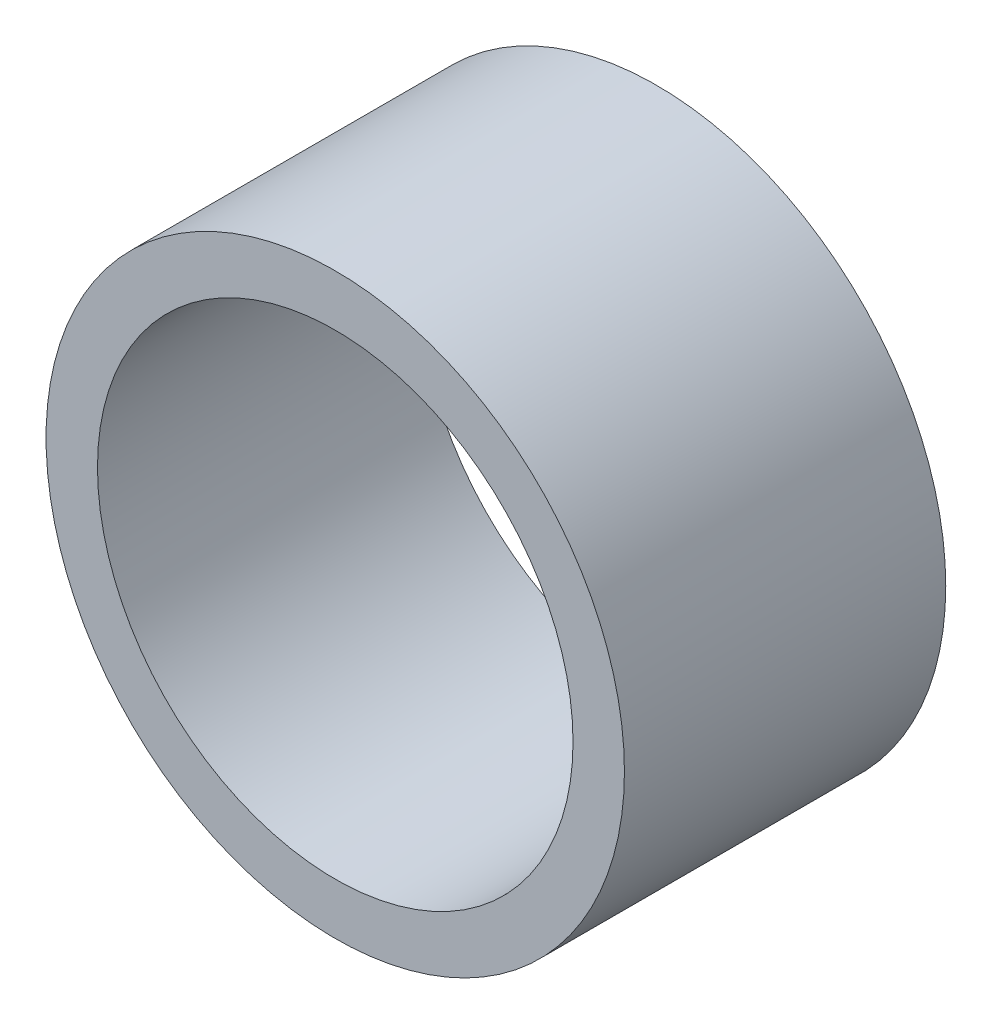
ISO-10303-21;
HEADER;
FILE_DESCRIPTION(('STEP AP214'),'2;1');
FILE_NAME('part.step','',(''),(''),'','','');
FILE_SCHEMA(('AUTOMOTIVE_DESIGN { 1 0 10303 214 1 1 1 1 }'));
ENDSEC;
DATA;
#1=APPLICATION_CONTEXT('core data for automotive mechanical design processes');
#2=APPLICATION_PROTOCOL_DEFINITION('international standard','automotive_design',2000,#1);
#3=PRODUCT_CONTEXT('',#1,'mechanical');
#4=PRODUCT('Part','Part','',(#3));
#5=PRODUCT_RELATED_PRODUCT_CATEGORY('part','',(#4));
#6=PRODUCT_DEFINITION_FORMATION('','',#4);
#7=PRODUCT_DEFINITION_CONTEXT('part definition',#1,'design');
#8=PRODUCT_DEFINITION('design','',#6,#7);
#9=PRODUCT_DEFINITION_SHAPE('','',#8);
#10=(LENGTH_UNIT() NAMED_UNIT(*) SI_UNIT(.MILLI.,.METRE.));
#11=(NAMED_UNIT(*) PLANE_ANGLE_UNIT() SI_UNIT($,.RADIAN.));
#12=(NAMED_UNIT(*) SI_UNIT($,.STERADIAN.) SOLID_ANGLE_UNIT());
#13=UNCERTAINTY_MEASURE_WITH_UNIT(LENGTH_MEASURE(1.E-05),#10,'distance_accuracy_value','');
#14=(GEOMETRIC_REPRESENTATION_CONTEXT(3) GLOBAL_UNCERTAINTY_ASSIGNED_CONTEXT((#13)) GLOBAL_UNIT_ASSIGNED_CONTEXT((#10,
#11,#12)) REPRESENTATION_CONTEXT('',''));
#15=CARTESIAN_POINT('',(0.,0.,0.));
#16=DIRECTION('',(0.,0.,1.));
#17=DIRECTION('',(1.,0.,0.));
#18=AXIS2_PLACEMENT_3D('',#15,#16,#17);
#19=CARTESIAN_POINT('',(0.,0.,5.));
#20=DIRECTION('',(0.,0.,1.));
#21=DIRECTION('',(1.,0.,0.));
#22=AXIS2_PLACEMENT_3D('',#19,#20,#21);
#23=PLANE('',#22);
#24=CARTESIAN_POINT('',(0.,0.,5.));
#25=DIRECTION('',(0.,0.,1.));
#26=DIRECTION('',(1.,0.,0.));
#27=AXIS2_PLACEMENT_3D('',#24,#25,#26);
#28=CIRCLE('',#27,4.5);
#29=CARTESIAN_POINT('',(4.5,0.,5.));
#30=VERTEX_POINT('',#29);
#31=EDGE_CURVE('E10',#30,#30,#28,.T.);
#32=ORIENTED_EDGE('',*,*,#31,.T.);
#33=EDGE_LOOP('',(#32));
#34=FACE_BOUND('',#33,.T.);
#35=CARTESIAN_POINT('',(0.,0.,5.));
#36=DIRECTION('',(0.,0.,1.));
#37=DIRECTION('',(1.,0.,0.));
#38=AXIS2_PLACEMENT_3D('',#35,#36,#37);
#39=CIRCLE('',#38,3.7);
#40=CARTESIAN_POINT('',(3.7,0.,5.));
#41=VERTEX_POINT('',#40);
#42=EDGE_CURVE('E48',#41,#41,#39,.T.);
#43=ORIENTED_EDGE('',*,*,#42,.F.);
#44=EDGE_LOOP('',(#43));
#45=FACE_BOUND('',#44,.T.);
#46=ADVANCED_FACE('F37',(#34,#45),#23,.T.);
#47=CARTESIAN_POINT('',(0.,0.,0.));
#48=DIRECTION('',(0.,0.,1.));
#49=DIRECTION('',(1.,0.,0.));
#50=AXIS2_PLACEMENT_3D('',#47,#48,#49);
#51=PLANE('',#50);
#52=CARTESIAN_POINT('',(0.,0.,0.));
#53=DIRECTION('',(0.,0.,1.));
#54=DIRECTION('',(1.,0.,0.));
#55=AXIS2_PLACEMENT_3D('',#52,#53,#54);
#56=CIRCLE('',#55,4.5);
#57=CARTESIAN_POINT('',(4.5,0.,0.));
#58=VERTEX_POINT('',#57);
#59=EDGE_CURVE('E41',#58,#58,#56,.T.);
#60=ORIENTED_EDGE('',*,*,#59,.F.);
#61=EDGE_LOOP('',(#60));
#62=FACE_BOUND('',#61,.T.);
#63=CARTESIAN_POINT('',(0.,0.,0.));
#64=DIRECTION('',(0.,0.,1.));
#65=DIRECTION('',(1.,0.,0.));
#66=AXIS2_PLACEMENT_3D('',#63,#64,#65);
#67=CIRCLE('',#66,3.7);
#68=CARTESIAN_POINT('',(3.7,0.,0.));
#69=VERTEX_POINT('',#68);
#70=EDGE_CURVE('E50',#69,#69,#67,.T.);
#71=ORIENTED_EDGE('',*,*,#70,.T.);
#72=EDGE_LOOP('',(#71));
#73=FACE_BOUND('',#72,.T.);
#74=ADVANCED_FACE('F60',(#62,#73),#51,.F.);
#75=CARTESIAN_POINT('',(0.,0.,5.));
#76=DIRECTION('',(0.,0.,-1.));
#77=DIRECTION('',(-1.,0.,0.));
#78=AXIS2_PLACEMENT_3D('',#75,#76,#77);
#79=CYLINDRICAL_SURFACE('',#78,4.5);
#80=ORIENTED_EDGE('',*,*,#31,.F.);
#81=EDGE_LOOP('',(#80));
#82=FACE_BOUND('',#81,.T.);
#83=ORIENTED_EDGE('',*,*,#59,.T.);
#84=EDGE_LOOP('',(#83));
#85=FACE_BOUND('',#84,.T.);
#86=ADVANCED_FACE('F39',(#82,#85),#79,.T.);
#87=CARTESIAN_POINT('',(0.,0.,5.));
#88=DIRECTION('',(0.,0.,-1.));
#89=DIRECTION('',(-1.,0.,0.));
#90=AXIS2_PLACEMENT_3D('',#87,#88,#89);
#91=CYLINDRICAL_SURFACE('',#90,3.7);
#92=ORIENTED_EDGE('',*,*,#42,.T.);
#93=EDGE_LOOP('',(#92));
#94=FACE_BOUND('',#93,.T.);
#95=ORIENTED_EDGE('',*,*,#70,.F.);
#96=EDGE_LOOP('',(#95));
#97=FACE_BOUND('',#96,.T.);
#98=ADVANCED_FACE('F56',(#94,#97),#91,.F.);
#99=CLOSED_SHELL('',(#46,#74,#86,#98));
#100=MANIFOLD_SOLID_BREP('B2',#99);
#101=ADVANCED_BREP_SHAPE_REPRESENTATION('',(#18,#100),#14);
#102=SHAPE_DEFINITION_REPRESENTATION(#9,#101);
ENDSEC;
END-ISO-10303-21;
